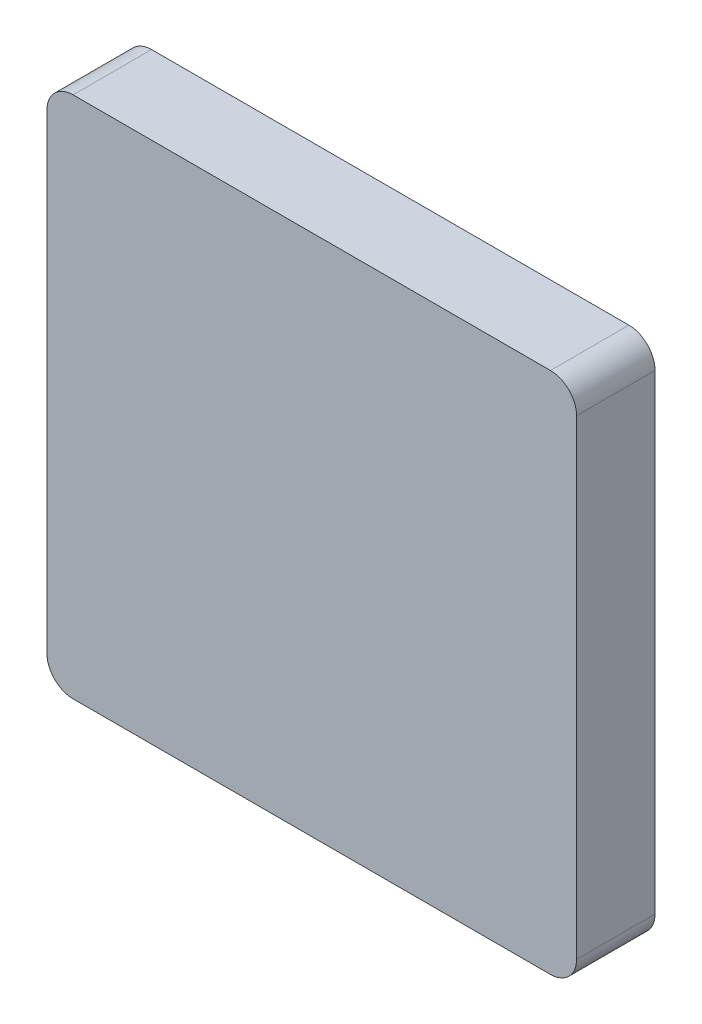
ISO-10303-21;
HEADER;
FILE_DESCRIPTION(('STEP AP214'),'2;1');
FILE_NAME('part.step','',(''),(''),'','','');
FILE_SCHEMA(('AUTOMOTIVE_DESIGN { 1 0 10303 214 1 1 1 1 }'));
ENDSEC;
DATA;
#1=APPLICATION_CONTEXT('core data for automotive mechanical design processes');
#2=APPLICATION_PROTOCOL_DEFINITION('international standard','automotive_design',2000,#1);
#3=PRODUCT_CONTEXT('',#1,'mechanical');
#4=PRODUCT('Part','Part','',(#3));
#5=PRODUCT_RELATED_PRODUCT_CATEGORY('part','',(#4));
#6=PRODUCT_DEFINITION_FORMATION('','',#4);
#7=PRODUCT_DEFINITION_CONTEXT('part definition',#1,'design');
#8=PRODUCT_DEFINITION('design','',#6,#7);
#9=PRODUCT_DEFINITION_SHAPE('','',#8);
#10=(LENGTH_UNIT() NAMED_UNIT(*) SI_UNIT(.MILLI.,.METRE.));
#11=(NAMED_UNIT(*) PLANE_ANGLE_UNIT() SI_UNIT($,.RADIAN.));
#12=(NAMED_UNIT(*) SI_UNIT($,.STERADIAN.) SOLID_ANGLE_UNIT());
#13=UNCERTAINTY_MEASURE_WITH_UNIT(LENGTH_MEASURE(1.E-05),#10,'distance_accuracy_value','');
#14=(GEOMETRIC_REPRESENTATION_CONTEXT(3) GLOBAL_UNCERTAINTY_ASSIGNED_CONTEXT((#13)) GLOBAL_UNIT_ASSIGNED_CONTEXT((#10,
#11,#12)) REPRESENTATION_CONTEXT('',''));
#15=CARTESIAN_POINT('',(0.,0.,0.));
#16=DIRECTION('',(0.,0.,1.));
#17=DIRECTION('',(1.,0.,0.));
#18=AXIS2_PLACEMENT_3D('',#15,#16,#17);
#19=CARTESIAN_POINT('',(20.25,20.,6.));
#20=DIRECTION('',(-1.,0.,0.));
#21=DIRECTION('',(0.,0.,1.));
#22=AXIS2_PLACEMENT_3D('',#19,#20,#21);
#23=PLANE('',#22);
#24=DIRECTION('',(0.,1.,0.));
#25=VECTOR('',#24,1.);
#26=CARTESIAN_POINT('',(20.25,20.,6.));
#27=LINE('',#26,#25);
#28=CARTESIAN_POINT('',(20.25,-18.,6.));
#29=VERTEX_POINT('',#28);
#30=CARTESIAN_POINT('',(20.25,18.,6.));
#31=VERTEX_POINT('',#30);
#32=EDGE_CURVE('E137',#29,#31,#27,.T.);
#33=ORIENTED_EDGE('',*,*,#32,.F.);
#34=DIRECTION('',(0.,0.,-1.));
#35=VECTOR('',#34,1.);
#36=CARTESIAN_POINT('',(20.25,-18.,6.));
#37=LINE('',#36,#35);
#38=CARTESIAN_POINT('',(20.25,-18.,0.));
#39=VERTEX_POINT('',#38);
#40=EDGE_CURVE('E176',#29,#39,#37,.T.);
#41=ORIENTED_EDGE('',*,*,#40,.T.);
#42=DIRECTION('',(0.,1.,0.));
#43=VECTOR('',#42,1.);
#44=CARTESIAN_POINT('',(20.25,20.,0.));
#45=LINE('',#44,#43);
#46=CARTESIAN_POINT('',(20.25,18.,0.));
#47=VERTEX_POINT('',#46);
#48=EDGE_CURVE('E190',#39,#47,#45,.T.);
#49=ORIENTED_EDGE('',*,*,#48,.T.);
#50=DIRECTION('',(0.,0.,-1.));
#51=VECTOR('',#50,1.);
#52=CARTESIAN_POINT('',(20.25,18.,6.));
#53=LINE('',#52,#51);
#54=EDGE_CURVE('E173',#47,#31,#53,.F.);
#55=ORIENTED_EDGE('',*,*,#54,.T.);
#56=EDGE_LOOP('',(#33,#41,#49,#55));
#57=FACE_BOUND('',#56,.T.);
#58=ADVANCED_FACE('F41',(#57),#23,.F.);
#59=CARTESIAN_POINT('',(-20.25,20.,6.));
#60=DIRECTION('',(0.,-1.,0.));
#61=DIRECTION('',(0.,0.,-1.));
#62=AXIS2_PLACEMENT_3D('',#59,#60,#61);
#63=PLANE('',#62);
#64=DIRECTION('',(-1.,0.,0.));
#65=VECTOR('',#64,1.);
#66=CARTESIAN_POINT('',(-20.25,20.,6.));
#67=LINE('',#66,#65);
#68=CARTESIAN_POINT('',(18.25,20.,6.));
#69=VERTEX_POINT('',#68);
#70=CARTESIAN_POINT('',(-18.25,20.,6.));
#71=VERTEX_POINT('',#70);
#72=EDGE_CURVE('E142',#69,#71,#67,.T.);
#73=ORIENTED_EDGE('',*,*,#72,.F.);
#74=DIRECTION('',(0.,0.,-1.));
#75=VECTOR('',#74,1.);
#76=CARTESIAN_POINT('',(18.25,20.,6.));
#77=LINE('',#76,#75);
#78=CARTESIAN_POINT('',(18.25,20.,0.));
#79=VERTEX_POINT('',#78);
#80=EDGE_CURVE('E11',#69,#79,#77,.T.);
#81=ORIENTED_EDGE('',*,*,#80,.T.);
#82=DIRECTION('',(-1.,0.,0.));
#83=VECTOR('',#82,1.);
#84=CARTESIAN_POINT('',(-20.25,20.,0.));
#85=LINE('',#84,#83);
#86=CARTESIAN_POINT('',(-18.25,20.,0.));
#87=VERTEX_POINT('',#86);
#88=EDGE_CURVE('E144',#79,#87,#85,.T.);
#89=ORIENTED_EDGE('',*,*,#88,.T.);
#90=DIRECTION('',(0.,0.,-1.));
#91=VECTOR('',#90,1.);
#92=CARTESIAN_POINT('',(-18.25,20.,6.));
#93=LINE('',#92,#91);
#94=EDGE_CURVE('E50',#87,#71,#93,.F.);
#95=ORIENTED_EDGE('',*,*,#94,.T.);
#96=EDGE_LOOP('',(#73,#81,#89,#95));
#97=FACE_BOUND('',#96,.T.);
#98=ADVANCED_FACE('F195',(#97),#63,.F.);
#99=CARTESIAN_POINT('',(-20.25,20.,6.));
#100=DIRECTION('',(1.,0.,0.));
#101=DIRECTION('',(0.,0.,-1.));
#102=AXIS2_PLACEMENT_3D('',#99,#100,#101);
#103=PLANE('',#102);
#104=DIRECTION('',(0.,-1.,0.));
#105=VECTOR('',#104,1.);
#106=CARTESIAN_POINT('',(-20.25,20.,0.));
#107=LINE('',#106,#105);
#108=CARTESIAN_POINT('',(-20.25,18.,0.));
#109=VERTEX_POINT('',#108);
#110=CARTESIAN_POINT('',(-20.25,-18.,0.));
#111=VERTEX_POINT('',#110);
#112=EDGE_CURVE('E138',#109,#111,#107,.T.);
#113=ORIENTED_EDGE('',*,*,#112,.T.);
#114=DIRECTION('',(0.,0.,-1.));
#115=VECTOR('',#114,1.);
#116=CARTESIAN_POINT('',(-20.25,-18.,6.));
#117=LINE('',#116,#115);
#118=CARTESIAN_POINT('',(-20.25,-18.,6.));
#119=VERTEX_POINT('',#118);
#120=EDGE_CURVE('E113',#111,#119,#117,.F.);
#121=ORIENTED_EDGE('',*,*,#120,.T.);
#122=DIRECTION('',(0.,-1.,0.));
#123=VECTOR('',#122,1.);
#124=CARTESIAN_POINT('',(-20.25,20.,6.));
#125=LINE('',#124,#123);
#126=CARTESIAN_POINT('',(-20.25,18.,6.));
#127=VERTEX_POINT('',#126);
#128=EDGE_CURVE('E182',#127,#119,#125,.T.);
#129=ORIENTED_EDGE('',*,*,#128,.F.);
#130=DIRECTION('',(0.,0.,-1.));
#131=VECTOR('',#130,1.);
#132=CARTESIAN_POINT('',(-20.25,18.,6.));
#133=LINE('',#132,#131);
#134=EDGE_CURVE('E119',#127,#109,#133,.T.);
#135=ORIENTED_EDGE('',*,*,#134,.T.);
#136=EDGE_LOOP('',(#113,#121,#129,#135));
#137=FACE_BOUND('',#136,.T.);
#138=ADVANCED_FACE('F202',(#137),#103,.F.);
#139=CARTESIAN_POINT('',(-20.25,-20.,6.));
#140=DIRECTION('',(0.,1.,0.));
#141=DIRECTION('',(0.,0.,1.));
#142=AXIS2_PLACEMENT_3D('',#139,#140,#141);
#143=PLANE('',#142);
#144=DIRECTION('',(1.,0.,0.));
#145=VECTOR('',#144,1.);
#146=CARTESIAN_POINT('',(-20.25,-20.,6.));
#147=LINE('',#146,#145);
#148=CARTESIAN_POINT('',(-18.25,-20.,6.));
#149=VERTEX_POINT('',#148);
#150=CARTESIAN_POINT('',(18.25,-20.,6.));
#151=VERTEX_POINT('',#150);
#152=EDGE_CURVE('E129',#149,#151,#147,.T.);
#153=ORIENTED_EDGE('',*,*,#152,.F.);
#154=DIRECTION('',(0.,0.,-1.));
#155=VECTOR('',#154,1.);
#156=CARTESIAN_POINT('',(-18.25,-20.,6.));
#157=LINE('',#156,#155);
#158=CARTESIAN_POINT('',(-18.25,-20.,0.));
#159=VERTEX_POINT('',#158);
#160=EDGE_CURVE('E112',#149,#159,#157,.T.);
#161=ORIENTED_EDGE('',*,*,#160,.T.);
#162=DIRECTION('',(1.,0.,0.));
#163=VECTOR('',#162,1.);
#164=CARTESIAN_POINT('',(-20.25,-20.,0.));
#165=LINE('',#164,#163);
#166=CARTESIAN_POINT('',(18.25,-20.,0.));
#167=VERTEX_POINT('',#166);
#168=EDGE_CURVE('E126',#159,#167,#165,.T.);
#169=ORIENTED_EDGE('',*,*,#168,.T.);
#170=DIRECTION('',(0.,0.,-1.));
#171=VECTOR('',#170,1.);
#172=CARTESIAN_POINT('',(18.25,-20.,6.));
#173=LINE('',#172,#171);
#174=EDGE_CURVE('E132',#167,#151,#173,.F.);
#175=ORIENTED_EDGE('',*,*,#174,.T.);
#176=EDGE_LOOP('',(#153,#161,#169,#175));
#177=FACE_BOUND('',#176,.T.);
#178=ADVANCED_FACE('F125',(#177),#143,.F.);
#179=CARTESIAN_POINT('',(0.,0.,6.));
#180=DIRECTION('',(0.,0.,1.));
#181=DIRECTION('',(1.,0.,0.));
#182=AXIS2_PLACEMENT_3D('',#179,#180,#181);
#183=PLANE('',#182);
#184=ORIENTED_EDGE('',*,*,#128,.T.);
#185=CARTESIAN_POINT('',(-18.25,-18.,6.));
#186=DIRECTION('',(0.,0.,1.));
#187=DIRECTION('',(1.,0.,0.));
#188=AXIS2_PLACEMENT_3D('',#185,#186,#187);
#189=CIRCLE('',#188,2.);
#190=EDGE_CURVE('E170',#119,#149,#189,.T.);
#191=ORIENTED_EDGE('',*,*,#190,.T.);
#192=ORIENTED_EDGE('',*,*,#152,.T.);
#193=CARTESIAN_POINT('',(18.25,-18.,6.));
#194=DIRECTION('',(0.,0.,1.));
#195=DIRECTION('',(1.,0.,0.));
#196=AXIS2_PLACEMENT_3D('',#193,#194,#195);
#197=CIRCLE('',#196,2.);
#198=EDGE_CURVE('E167',#151,#29,#197,.T.);
#199=ORIENTED_EDGE('',*,*,#198,.T.);
#200=ORIENTED_EDGE('',*,*,#32,.T.);
#201=CARTESIAN_POINT('',(18.25,18.,6.));
#202=DIRECTION('',(0.,0.,1.));
#203=DIRECTION('',(1.,0.,0.));
#204=AXIS2_PLACEMENT_3D('',#201,#202,#203);
#205=CIRCLE('',#204,2.);
#206=EDGE_CURVE('E63',#31,#69,#205,.T.);
#207=ORIENTED_EDGE('',*,*,#206,.T.);
#208=ORIENTED_EDGE('',*,*,#72,.T.);
#209=CARTESIAN_POINT('',(-18.25,18.,6.));
#210=DIRECTION('',(0.,0.,1.));
#211=DIRECTION('',(1.,0.,0.));
#212=AXIS2_PLACEMENT_3D('',#209,#210,#211);
#213=CIRCLE('',#212,2.);
#214=EDGE_CURVE('E162',#71,#127,#213,.T.);
#215=ORIENTED_EDGE('',*,*,#214,.T.);
#216=EDGE_LOOP('',(#184,#191,#192,#199,#200,#207,#208,#215));
#217=FACE_BOUND('',#216,.T.);
#218=ADVANCED_FACE('F200',(#217),#183,.T.);
#219=CARTESIAN_POINT('',(0.,0.,0.));
#220=DIRECTION('',(0.,0.,1.));
#221=DIRECTION('',(1.,0.,0.));
#222=AXIS2_PLACEMENT_3D('',#219,#220,#221);
#223=PLANE('',#222);
#224=ORIENTED_EDGE('',*,*,#168,.F.);
#225=CARTESIAN_POINT('',(-18.25,-18.,0.));
#226=DIRECTION('',(0.,0.,1.));
#227=DIRECTION('',(1.,0.,0.));
#228=AXIS2_PLACEMENT_3D('',#225,#226,#227);
#229=CIRCLE('',#228,2.);
#230=EDGE_CURVE('E108',#159,#111,#229,.F.);
#231=ORIENTED_EDGE('',*,*,#230,.T.);
#232=ORIENTED_EDGE('',*,*,#112,.F.);
#233=CARTESIAN_POINT('',(-18.25,18.,0.));
#234=DIRECTION('',(0.,0.,1.));
#235=DIRECTION('',(1.,0.,0.));
#236=AXIS2_PLACEMENT_3D('',#233,#234,#235);
#237=CIRCLE('',#236,2.);
#238=EDGE_CURVE('E131',#109,#87,#237,.F.);
#239=ORIENTED_EDGE('',*,*,#238,.T.);
#240=ORIENTED_EDGE('',*,*,#88,.F.);
#241=CARTESIAN_POINT('',(18.25,18.,0.));
#242=DIRECTION('',(0.,0.,1.));
#243=DIRECTION('',(1.,0.,0.));
#244=AXIS2_PLACEMENT_3D('',#241,#242,#243);
#245=CIRCLE('',#244,2.);
#246=EDGE_CURVE('E152',#79,#47,#245,.F.);
#247=ORIENTED_EDGE('',*,*,#246,.T.);
#248=ORIENTED_EDGE('',*,*,#48,.F.);
#249=CARTESIAN_POINT('',(18.25,-18.,0.));
#250=DIRECTION('',(0.,0.,1.));
#251=DIRECTION('',(1.,0.,0.));
#252=AXIS2_PLACEMENT_3D('',#249,#250,#251);
#253=CIRCLE('',#252,2.);
#254=EDGE_CURVE('E120',#39,#167,#253,.F.);
#255=ORIENTED_EDGE('',*,*,#254,.T.);
#256=EDGE_LOOP('',(#224,#231,#232,#239,#240,#247,#248,#255));
#257=FACE_BOUND('',#256,.T.);
#258=ADVANCED_FACE('F134',(#257),#223,.F.);
#259=CARTESIAN_POINT('',(-18.25,-18.,6.));
#260=DIRECTION('',(0.,0.,-1.));
#261=DIRECTION('',(-1.,0.,0.));
#262=AXIS2_PLACEMENT_3D('',#259,#260,#261);
#263=CYLINDRICAL_SURFACE('',#262,2.);
#264=ORIENTED_EDGE('',*,*,#190,.F.);
#265=ORIENTED_EDGE('',*,*,#120,.F.);
#266=ORIENTED_EDGE('',*,*,#230,.F.);
#267=ORIENTED_EDGE('',*,*,#160,.F.);
#268=EDGE_LOOP('',(#264,#265,#266,#267));
#269=FACE_BOUND('',#268,.T.);
#270=ADVANCED_FACE('F111',(#269),#263,.T.);
#271=CARTESIAN_POINT('',(18.25,-18.,6.));
#272=DIRECTION('',(0.,0.,-1.));
#273=DIRECTION('',(-1.,0.,0.));
#274=AXIS2_PLACEMENT_3D('',#271,#272,#273);
#275=CYLINDRICAL_SURFACE('',#274,2.);
#276=ORIENTED_EDGE('',*,*,#198,.F.);
#277=ORIENTED_EDGE('',*,*,#174,.F.);
#278=ORIENTED_EDGE('',*,*,#254,.F.);
#279=ORIENTED_EDGE('',*,*,#40,.F.);
#280=EDGE_LOOP('',(#276,#277,#278,#279));
#281=FACE_BOUND('',#280,.T.);
#282=ADVANCED_FACE('F220',(#281),#275,.T.);
#283=CARTESIAN_POINT('',(18.25,18.,6.));
#284=DIRECTION('',(0.,0.,-1.));
#285=DIRECTION('',(-1.,0.,0.));
#286=AXIS2_PLACEMENT_3D('',#283,#284,#285);
#287=CYLINDRICAL_SURFACE('',#286,2.);
#288=ORIENTED_EDGE('',*,*,#206,.F.);
#289=ORIENTED_EDGE('',*,*,#54,.F.);
#290=ORIENTED_EDGE('',*,*,#246,.F.);
#291=ORIENTED_EDGE('',*,*,#80,.F.);
#292=EDGE_LOOP('',(#288,#289,#290,#291));
#293=FACE_BOUND('',#292,.T.);
#294=ADVANCED_FACE('F222',(#293),#287,.T.);
#295=CARTESIAN_POINT('',(-18.25,18.,6.));
#296=DIRECTION('',(0.,0.,-1.));
#297=DIRECTION('',(-1.,0.,0.));
#298=AXIS2_PLACEMENT_3D('',#295,#296,#297);
#299=CYLINDRICAL_SURFACE('',#298,2.);
#300=ORIENTED_EDGE('',*,*,#214,.F.);
#301=ORIENTED_EDGE('',*,*,#94,.F.);
#302=ORIENTED_EDGE('',*,*,#238,.F.);
#303=ORIENTED_EDGE('',*,*,#134,.F.);
#304=EDGE_LOOP('',(#300,#301,#302,#303));
#305=FACE_BOUND('',#304,.T.);
#306=ADVANCED_FACE('F43',(#305),#299,.T.);
#307=CLOSED_SHELL('',(#58,#98,#138,#178,#218,#258,#270,#282,#294,#306));
#308=MANIFOLD_SOLID_BREP('B2',#307);
#309=ADVANCED_BREP_SHAPE_REPRESENTATION('',(#18,#308),#14);
#310=SHAPE_DEFINITION_REPRESENTATION(#9,#309);
ENDSEC;
END-ISO-10303-21;
